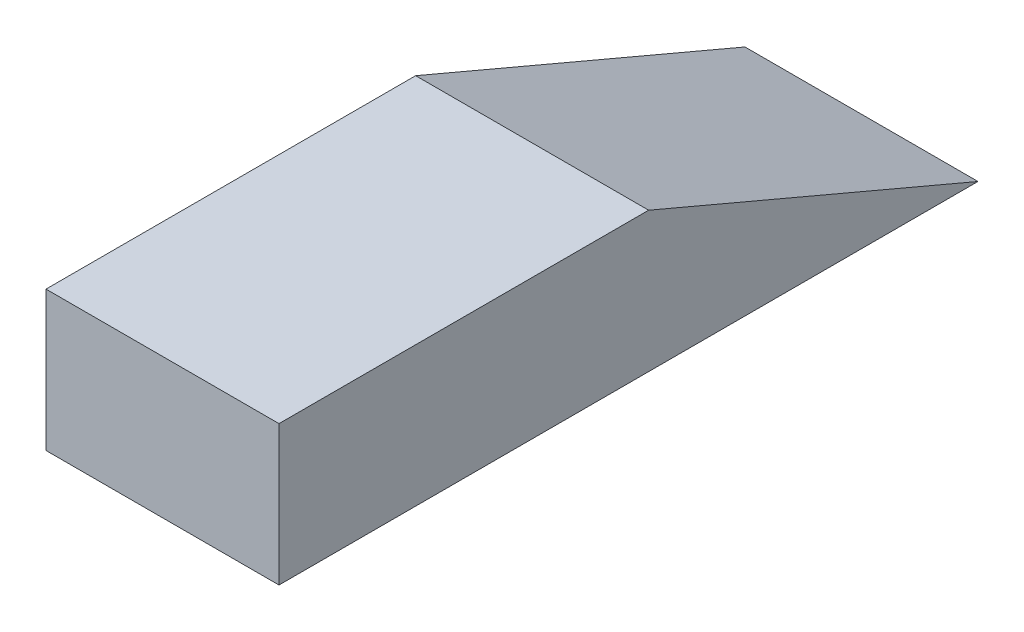
ISO-10303-21;
HEADER;
FILE_DESCRIPTION(('STEP AP214'),'2;1');
FILE_NAME('part.step','',(''),(''),'','','');
FILE_SCHEMA(('AUTOMOTIVE_DESIGN { 1 0 10303 214 1 1 1 1 }'));
ENDSEC;
DATA;
#1=APPLICATION_CONTEXT('core data for automotive mechanical design processes');
#2=APPLICATION_PROTOCOL_DEFINITION('international standard','automotive_design',2000,#1);
#3=PRODUCT_CONTEXT('',#1,'mechanical');
#4=PRODUCT('Part','Part','',(#3));
#5=PRODUCT_RELATED_PRODUCT_CATEGORY('part','',(#4));
#6=PRODUCT_DEFINITION_FORMATION('','',#4);
#7=PRODUCT_DEFINITION_CONTEXT('part definition',#1,'design');
#8=PRODUCT_DEFINITION('design','',#6,#7);
#9=PRODUCT_DEFINITION_SHAPE('','',#8);
#10=(LENGTH_UNIT() NAMED_UNIT(*) SI_UNIT(.MILLI.,.METRE.));
#11=(NAMED_UNIT(*) PLANE_ANGLE_UNIT() SI_UNIT($,.RADIAN.));
#12=(NAMED_UNIT(*) SI_UNIT($,.STERADIAN.) SOLID_ANGLE_UNIT());
#13=UNCERTAINTY_MEASURE_WITH_UNIT(LENGTH_MEASURE(1.E-05),#10,'distance_accuracy_value','');
#14=(GEOMETRIC_REPRESENTATION_CONTEXT(3) GLOBAL_UNCERTAINTY_ASSIGNED_CONTEXT((#13)) GLOBAL_UNIT_ASSIGNED_CONTEXT((#10,
#11,#12)) REPRESENTATION_CONTEXT('',''));
#15=CARTESIAN_POINT('',(0.,0.,0.));
#16=DIRECTION('',(0.,0.,1.));
#17=DIRECTION('',(1.,0.,0.));
#18=AXIS2_PLACEMENT_3D('',#15,#16,#17);
#19=CARTESIAN_POINT('',(25.,15.,150.));
#20=DIRECTION('',(-1.,0.,0.));
#21=DIRECTION('',(0.,-1.,0.));
#22=AXIS2_PLACEMENT_3D('',#19,#20,#21);
#23=PLANE('',#22);
#24=DIRECTION('',(0.,0.,-1.));
#25=VECTOR('',#24,1.);
#26=CARTESIAN_POINT('',(25.,-15.,150.));
#27=LINE('',#26,#25);
#28=CARTESIAN_POINT('',(25.,-15.,150.));
#29=VERTEX_POINT('',#28);
#30=CARTESIAN_POINT('',(25.,-15.,0.));
#31=VERTEX_POINT('',#30);
#32=EDGE_CURVE('E91',#29,#31,#27,.T.);
#33=ORIENTED_EDGE('',*,*,#32,.T.);
#34=DIRECTION('',(0.,-0.390731128489278,-0.920504853452439));
#35=VECTOR('',#34,1.);
#36=CARTESIAN_POINT('',(25.,-15.,0.));
#37=LINE('',#36,#35);
#38=CARTESIAN_POINT('',(25.,15.,70.6755709747117));
#39=VERTEX_POINT('',#38);
#40=EDGE_CURVE('E80',#39,#31,#37,.T.);
#41=ORIENTED_EDGE('',*,*,#40,.F.);
#42=DIRECTION('',(0.,0.,-1.));
#43=VECTOR('',#42,1.);
#44=CARTESIAN_POINT('',(25.,15.,150.));
#45=LINE('',#44,#43);
#46=CARTESIAN_POINT('',(25.,15.,150.));
#47=VERTEX_POINT('',#46);
#48=EDGE_CURVE('E11',#47,#39,#45,.T.);
#49=ORIENTED_EDGE('',*,*,#48,.F.);
#50=DIRECTION('',(0.,1.,0.));
#51=VECTOR('',#50,1.);
#52=CARTESIAN_POINT('',(25.,15.,150.));
#53=LINE('',#52,#51);
#54=EDGE_CURVE('E97',#29,#47,#53,.T.);
#55=ORIENTED_EDGE('',*,*,#54,.F.);
#56=EDGE_LOOP('',(#33,#41,#49,#55));
#57=FACE_BOUND('',#56,.T.);
#58=ADVANCED_FACE('F33',(#57),#23,.F.);
#59=CARTESIAN_POINT('',(-25.,15.,150.));
#60=DIRECTION('',(0.,-1.,0.));
#61=DIRECTION('',(0.,0.,-1.));
#62=AXIS2_PLACEMENT_3D('',#59,#60,#61);
#63=PLANE('',#62);
#64=ORIENTED_EDGE('',*,*,#48,.T.);
#65=DIRECTION('',(1.,0.,0.));
#66=VECTOR('',#65,1.);
#67=CARTESIAN_POINT('',(-25.,15.,70.6755709747117));
#68=LINE('',#67,#66);
#69=CARTESIAN_POINT('',(-25.,15.,70.6755709747117));
#70=VERTEX_POINT('',#69);
#71=EDGE_CURVE('E72',#70,#39,#68,.T.);
#72=ORIENTED_EDGE('',*,*,#71,.F.);
#73=DIRECTION('',(0.,0.,-1.));
#74=VECTOR('',#73,1.);
#75=CARTESIAN_POINT('',(-25.,15.,150.));
#76=LINE('',#75,#74);
#77=CARTESIAN_POINT('',(-25.,15.,150.));
#78=VERTEX_POINT('',#77);
#79=EDGE_CURVE('E41',#78,#70,#76,.T.);
#80=ORIENTED_EDGE('',*,*,#79,.F.);
#81=DIRECTION('',(-1.,0.,0.));
#82=VECTOR('',#81,1.);
#83=CARTESIAN_POINT('',(-25.,15.,150.));
#84=LINE('',#83,#82);
#85=EDGE_CURVE('E100',#47,#78,#84,.T.);
#86=ORIENTED_EDGE('',*,*,#85,.F.);
#87=EDGE_LOOP('',(#64,#72,#80,#86));
#88=FACE_BOUND('',#87,.T.);
#89=ADVANCED_FACE('F84',(#88),#63,.F.);
#90=CARTESIAN_POINT('',(-25.,15.,150.));
#91=DIRECTION('',(1.,0.,0.));
#92=DIRECTION('',(0.,1.,0.));
#93=AXIS2_PLACEMENT_3D('',#90,#91,#92);
#94=PLANE('',#93);
#95=ORIENTED_EDGE('',*,*,#79,.T.);
#96=DIRECTION('',(0.,-0.390731128489278,-0.920504853452439));
#97=VECTOR('',#96,1.);
#98=CARTESIAN_POINT('',(-25.,-15.,0.));
#99=LINE('',#98,#97);
#100=CARTESIAN_POINT('',(-25.,-15.,0.));
#101=VERTEX_POINT('',#100);
#102=EDGE_CURVE('E68',#70,#101,#99,.T.);
#103=ORIENTED_EDGE('',*,*,#102,.T.);
#104=DIRECTION('',(0.,0.,-1.));
#105=VECTOR('',#104,1.);
#106=CARTESIAN_POINT('',(-25.,-15.,150.));
#107=LINE('',#106,#105);
#108=CARTESIAN_POINT('',(-25.,-15.,150.));
#109=VERTEX_POINT('',#108);
#110=EDGE_CURVE('E90',#109,#101,#107,.T.);
#111=ORIENTED_EDGE('',*,*,#110,.F.);
#112=DIRECTION('',(0.,-1.,0.));
#113=VECTOR('',#112,1.);
#114=CARTESIAN_POINT('',(-25.,15.,150.));
#115=LINE('',#114,#113);
#116=EDGE_CURVE('E89',#78,#109,#115,.T.);
#117=ORIENTED_EDGE('',*,*,#116,.F.);
#118=EDGE_LOOP('',(#95,#103,#111,#117));
#119=FACE_BOUND('',#118,.T.);
#120=ADVANCED_FACE('F88',(#119),#94,.F.);
#121=CARTESIAN_POINT('',(-25.,-15.,150.));
#122=DIRECTION('',(0.,1.,0.));
#123=DIRECTION('',(0.,0.,1.));
#124=AXIS2_PLACEMENT_3D('',#121,#122,#123);
#125=PLANE('',#124);
#126=DIRECTION('',(1.,0.,0.));
#127=VECTOR('',#126,1.);
#128=CARTESIAN_POINT('',(-25.,-15.,0.));
#129=LINE('',#128,#127);
#130=EDGE_CURVE('E75',#101,#31,#129,.T.);
#131=ORIENTED_EDGE('',*,*,#130,.T.);
#132=ORIENTED_EDGE('',*,*,#32,.F.);
#133=DIRECTION('',(1.,0.,0.));
#134=VECTOR('',#133,1.);
#135=CARTESIAN_POINT('',(-25.,-15.,150.));
#136=LINE('',#135,#134);
#137=EDGE_CURVE('E48',#109,#29,#136,.T.);
#138=ORIENTED_EDGE('',*,*,#137,.F.);
#139=ORIENTED_EDGE('',*,*,#110,.T.);
#140=EDGE_LOOP('',(#131,#132,#138,#139));
#141=FACE_BOUND('',#140,.T.);
#142=ADVANCED_FACE('F105',(#141),#125,.F.);
#143=CARTESIAN_POINT('',(0.,0.,150.));
#144=DIRECTION('',(0.,0.,1.));
#145=DIRECTION('',(1.,0.,0.));
#146=AXIS2_PLACEMENT_3D('',#143,#144,#145);
#147=PLANE('',#146);
#148=ORIENTED_EDGE('',*,*,#54,.T.);
#149=ORIENTED_EDGE('',*,*,#85,.T.);
#150=ORIENTED_EDGE('',*,*,#116,.T.);
#151=ORIENTED_EDGE('',*,*,#137,.T.);
#152=EDGE_LOOP('',(#148,#149,#150,#151));
#153=FACE_BOUND('',#152,.T.);
#154=ADVANCED_FACE('F107',(#153),#147,.T.);
#155=CARTESIAN_POINT('',(-25.,-15.,0.));
#156=DIRECTION('',(0.,-0.920504853452439,0.390731128489278));
#157=DIRECTION('',(0.,-0.390731128489278,-0.920504853452439));
#158=AXIS2_PLACEMENT_3D('',#155,#156,#157);
#159=PLANE('',#158);
#160=ORIENTED_EDGE('',*,*,#40,.T.);
#161=ORIENTED_EDGE('',*,*,#130,.F.);
#162=ORIENTED_EDGE('',*,*,#102,.F.);
#163=ORIENTED_EDGE('',*,*,#71,.T.);
#164=EDGE_LOOP('',(#160,#161,#162,#163));
#165=FACE_BOUND('',#164,.T.);
#166=ADVANCED_FACE('F71',(#165),#159,.F.);
#167=CLOSED_SHELL('',(#58,#89,#120,#142,#154,#166));
#168=MANIFOLD_SOLID_BREP('B2',#167);
#169=ADVANCED_BREP_SHAPE_REPRESENTATION('',(#18,#168),#14);
#170=SHAPE_DEFINITION_REPRESENTATION(#9,#169);
ENDSEC;
END-ISO-10303-21;
